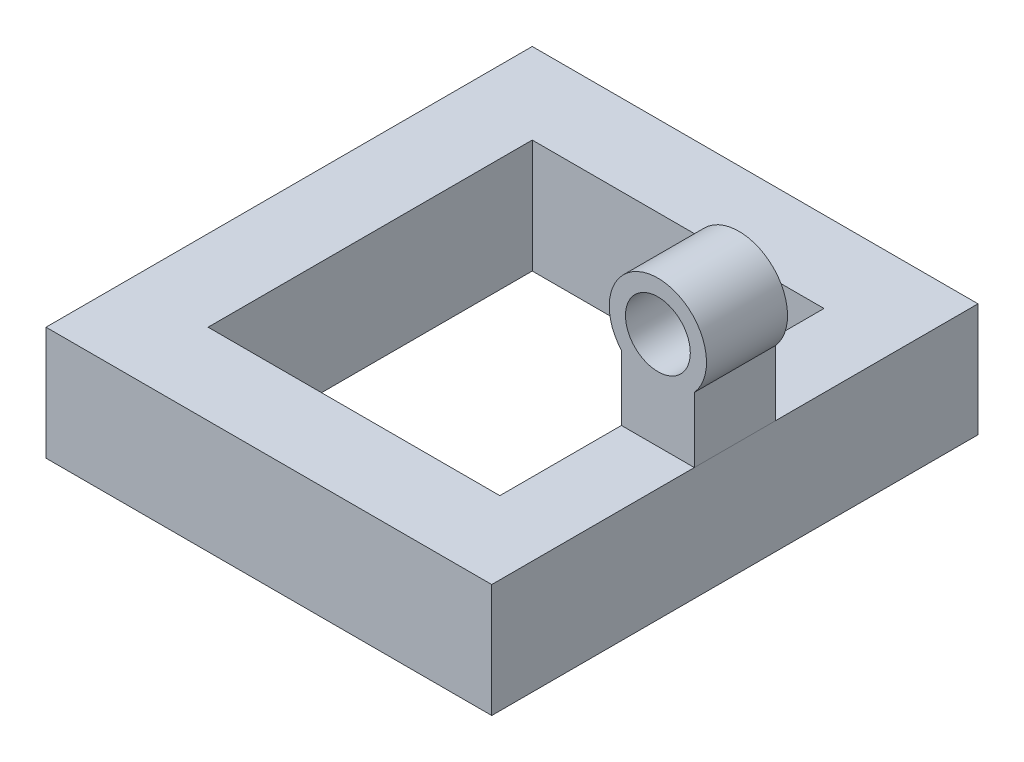
ISO-10303-21;
HEADER;
FILE_DESCRIPTION(('STEP AP214'),'2;1');
FILE_NAME('part.step','',(''),(''),'','','');
FILE_SCHEMA(('AUTOMOTIVE_DESIGN { 1 0 10303 214 1 1 1 1 }'));
ENDSEC;
DATA;
#1=APPLICATION_CONTEXT('core data for automotive mechanical design processes');
#2=APPLICATION_PROTOCOL_DEFINITION('international standard','automotive_design',2000,#1);
#3=PRODUCT_CONTEXT('',#1,'mechanical');
#4=PRODUCT('Part','Part','',(#3));
#5=PRODUCT_RELATED_PRODUCT_CATEGORY('part','',(#4));
#6=PRODUCT_DEFINITION_FORMATION('','',#4);
#7=PRODUCT_DEFINITION_CONTEXT('part definition',#1,'design');
#8=PRODUCT_DEFINITION('design','',#6,#7);
#9=PRODUCT_DEFINITION_SHAPE('','',#8);
#10=(LENGTH_UNIT() NAMED_UNIT(*) SI_UNIT(.MILLI.,.METRE.));
#11=(NAMED_UNIT(*) PLANE_ANGLE_UNIT() SI_UNIT($,.RADIAN.));
#12=(NAMED_UNIT(*) SI_UNIT($,.STERADIAN.) SOLID_ANGLE_UNIT());
#13=UNCERTAINTY_MEASURE_WITH_UNIT(LENGTH_MEASURE(1.E-05),#10,'distance_accuracy_value','');
#14=(GEOMETRIC_REPRESENTATION_CONTEXT(3) GLOBAL_UNCERTAINTY_ASSIGNED_CONTEXT((#13)) GLOBAL_UNIT_ASSIGNED_CONTEXT((#10,
#11,#12)) REPRESENTATION_CONTEXT('',''));
#15=CARTESIAN_POINT('',(0.,0.,0.));
#16=DIRECTION('',(0.,0.,1.));
#17=DIRECTION('',(1.,0.,0.));
#18=AXIS2_PLACEMENT_3D('',#15,#16,#17);
#19=CARTESIAN_POINT('',(50.5,26.,-25.));
#20=DIRECTION('',(0.,0.,1.));
#21=DIRECTION('',(1.,0.,0.));
#22=AXIS2_PLACEMENT_3D('',#19,#20,#21);
#23=PLANE('',#22);
#24=DIRECTION('',(0.,1.,0.));
#25=VECTOR('',#24,1.);
#26=CARTESIAN_POINT('',(55.,14.,-25.));
#27=LINE('',#26,#25);
#28=CARTESIAN_POINT('',(55.,14.,-25.));
#29=VERTEX_POINT('',#28);
#30=CARTESIAN_POINT('',(55.,22.0313730334031,-25.));
#31=VERTEX_POINT('',#30);
#32=EDGE_CURVE('E106',#29,#31,#27,.T.);
#33=ORIENTED_EDGE('',*,*,#32,.T.);
#34=CARTESIAN_POINT('',(50.5,26.,-25.));
#35=DIRECTION('',(0.,0.,1.));
#36=DIRECTION('',(1.,0.,0.));
#37=AXIS2_PLACEMENT_3D('',#34,#35,#36);
#38=CIRCLE('',#37,5.99999999999999);
#39=CARTESIAN_POINT('',(46.,22.0313730334031,-25.));
#40=VERTEX_POINT('',#39);
#41=EDGE_CURVE('E100',#31,#40,#38,.T.);
#42=ORIENTED_EDGE('',*,*,#41,.T.);
#43=DIRECTION('',(0.,-1.,0.));
#44=VECTOR('',#43,1.);
#45=CARTESIAN_POINT('',(46.,14.,-25.));
#46=LINE('',#45,#44);
#47=CARTESIAN_POINT('',(46.,14.,-25.));
#48=VERTEX_POINT('',#47);
#49=EDGE_CURVE('E103',#40,#48,#46,.T.);
#50=ORIENTED_EDGE('',*,*,#49,.T.);
#51=DIRECTION('',(1.,0.,0.));
#52=VECTOR('',#51,1.);
#53=CARTESIAN_POINT('',(50.5,14.,-25.));
#54=LINE('',#53,#52);
#55=EDGE_CURVE('E72',#48,#29,#54,.T.);
#56=ORIENTED_EDGE('',*,*,#55,.T.);
#57=EDGE_LOOP('',(#33,#42,#50,#56));
#58=FACE_BOUND('',#57,.T.);
#59=CARTESIAN_POINT('',(50.5,26.,-25.));
#60=DIRECTION('',(0.,0.,1.));
#61=DIRECTION('',(1.,0.,0.));
#62=AXIS2_PLACEMENT_3D('',#59,#60,#61);
#63=CIRCLE('',#62,4.);
#64=CARTESIAN_POINT('',(54.5,26.,-25.));
#65=VERTEX_POINT('',#64);
#66=EDGE_CURVE('E123',#65,#65,#63,.T.);
#67=ORIENTED_EDGE('',*,*,#66,.F.);
#68=EDGE_LOOP('',(#67));
#69=FACE_BOUND('',#68,.T.);
#70=ADVANCED_FACE('F55',(#58,#69),#23,.T.);
#71=CARTESIAN_POINT('',(50.5,26.,-35.));
#72=DIRECTION('',(0.,0.,1.));
#73=DIRECTION('',(1.,0.,0.));
#74=AXIS2_PLACEMENT_3D('',#71,#72,#73);
#75=PLANE('',#74);
#76=DIRECTION('',(0.,1.,0.));
#77=VECTOR('',#76,1.);
#78=CARTESIAN_POINT('',(55.,14.,-35.));
#79=LINE('',#78,#77);
#80=CARTESIAN_POINT('',(55.,14.,-35.));
#81=VERTEX_POINT('',#80);
#82=CARTESIAN_POINT('',(55.,22.0313730334031,-35.));
#83=VERTEX_POINT('',#82);
#84=EDGE_CURVE('E120',#81,#83,#79,.T.);
#85=ORIENTED_EDGE('',*,*,#84,.F.);
#86=DIRECTION('',(1.,0.,0.));
#87=VECTOR('',#86,1.);
#88=CARTESIAN_POINT('',(55.,14.,-35.));
#89=LINE('',#88,#87);
#90=CARTESIAN_POINT('',(46.,14.,-35.));
#91=VERTEX_POINT('',#90);
#92=EDGE_CURVE('E89',#91,#81,#89,.T.);
#93=ORIENTED_EDGE('',*,*,#92,.F.);
#94=DIRECTION('',(0.,-1.,0.));
#95=VECTOR('',#94,1.);
#96=CARTESIAN_POINT('',(46.,14.,-35.));
#97=LINE('',#96,#95);
#98=CARTESIAN_POINT('',(46.,22.0313730334031,-35.));
#99=VERTEX_POINT('',#98);
#100=EDGE_CURVE('E125',#99,#91,#97,.T.);
#101=ORIENTED_EDGE('',*,*,#100,.F.);
#102=CARTESIAN_POINT('',(50.5,26.,-35.));
#103=DIRECTION('',(0.,0.,1.));
#104=DIRECTION('',(1.,0.,0.));
#105=AXIS2_PLACEMENT_3D('',#102,#103,#104);
#106=CIRCLE('',#105,5.99999999999999);
#107=EDGE_CURVE('E111',#83,#99,#106,.T.);
#108=ORIENTED_EDGE('',*,*,#107,.F.);
#109=EDGE_LOOP('',(#85,#93,#101,#108));
#110=FACE_BOUND('',#109,.T.);
#111=CARTESIAN_POINT('',(50.5,26.,-35.));
#112=DIRECTION('',(0.,0.,1.));
#113=DIRECTION('',(1.,0.,0.));
#114=AXIS2_PLACEMENT_3D('',#111,#112,#113);
#115=CIRCLE('',#114,4.);
#116=CARTESIAN_POINT('',(54.5,26.,-35.));
#117=VERTEX_POINT('',#116);
#118=EDGE_CURVE('E132',#117,#117,#115,.T.);
#119=ORIENTED_EDGE('',*,*,#118,.T.);
#120=EDGE_LOOP('',(#119));
#121=FACE_BOUND('',#120,.T.);
#122=ADVANCED_FACE('F141',(#110,#121),#75,.F.);
#123=CARTESIAN_POINT('',(55.,14.,-25.));
#124=DIRECTION('',(-1.,0.,0.));
#125=DIRECTION('',(0.,0.,1.));
#126=AXIS2_PLACEMENT_3D('',#123,#124,#125);
#127=PLANE('',#126);
#128=ORIENTED_EDGE('',*,*,#84,.T.);
#129=DIRECTION('',(0.,0.,-1.));
#130=VECTOR('',#129,1.);
#131=CARTESIAN_POINT('',(55.,22.0313730334031,-25.));
#132=LINE('',#131,#130);
#133=EDGE_CURVE('E12',#31,#83,#132,.T.);
#134=ORIENTED_EDGE('',*,*,#133,.F.);
#135=ORIENTED_EDGE('',*,*,#32,.F.);
#136=DIRECTION('',(0.,0.,-1.));
#137=VECTOR('',#136,1.);
#138=CARTESIAN_POINT('',(55.,14.,-25.));
#139=LINE('',#138,#137);
#140=EDGE_CURVE('E116',#29,#81,#139,.T.);
#141=ORIENTED_EDGE('',*,*,#140,.T.);
#142=EDGE_LOOP('',(#128,#134,#135,#141));
#143=FACE_BOUND('',#142,.T.);
#144=ADVANCED_FACE('F57',(#143),#127,.F.);
#145=CARTESIAN_POINT('',(50.5,26.,-25.));
#146=DIRECTION('',(0.,0.,-1.));
#147=DIRECTION('',(-1.,0.,0.));
#148=AXIS2_PLACEMENT_3D('',#145,#146,#147);
#149=CYLINDRICAL_SURFACE('',#148,5.99999999999999);
#150=ORIENTED_EDGE('',*,*,#107,.T.);
#151=DIRECTION('',(0.,0.,-1.));
#152=VECTOR('',#151,1.);
#153=CARTESIAN_POINT('',(46.,22.0313730334031,-25.));
#154=LINE('',#153,#152);
#155=EDGE_CURVE('E64',#40,#99,#154,.T.);
#156=ORIENTED_EDGE('',*,*,#155,.F.);
#157=ORIENTED_EDGE('',*,*,#41,.F.);
#158=ORIENTED_EDGE('',*,*,#133,.T.);
#159=EDGE_LOOP('',(#150,#156,#157,#158));
#160=FACE_BOUND('',#159,.T.);
#161=ADVANCED_FACE('F110',(#160),#149,.T.);
#162=CARTESIAN_POINT('',(46.,14.,-25.));
#163=DIRECTION('',(1.,0.,0.));
#164=DIRECTION('',(0.,0.,-1.));
#165=AXIS2_PLACEMENT_3D('',#162,#163,#164);
#166=PLANE('',#165);
#167=ORIENTED_EDGE('',*,*,#100,.T.);
#168=DIRECTION('',(0.,0.,-1.));
#169=VECTOR('',#168,1.);
#170=CARTESIAN_POINT('',(46.,14.,-25.));
#171=LINE('',#170,#169);
#172=EDGE_CURVE('E113',#48,#91,#171,.T.);
#173=ORIENTED_EDGE('',*,*,#172,.F.);
#174=ORIENTED_EDGE('',*,*,#49,.F.);
#175=ORIENTED_EDGE('',*,*,#155,.T.);
#176=EDGE_LOOP('',(#167,#173,#174,#175));
#177=FACE_BOUND('',#176,.T.);
#178=ADVANCED_FACE('F114',(#177),#166,.F.);
#179=CARTESIAN_POINT('',(55.,14.,-25.));
#180=DIRECTION('',(0.,1.,0.));
#181=DIRECTION('',(0.,0.,1.));
#182=AXIS2_PLACEMENT_3D('',#179,#180,#181);
#183=PLANE('',#182);
#184=ORIENTED_EDGE('',*,*,#92,.T.);
#185=ORIENTED_EDGE('',*,*,#140,.F.);
#186=ORIENTED_EDGE('',*,*,#55,.F.);
#187=ORIENTED_EDGE('',*,*,#172,.T.);
#188=EDGE_LOOP('',(#184,#185,#186,#187));
#189=FACE_BOUND('',#188,.T.);
#190=ADVANCED_FACE('F129',(#189),#183,.F.);
#191=CARTESIAN_POINT('',(50.5,26.,-25.));
#192=DIRECTION('',(0.,0.,-1.));
#193=DIRECTION('',(-1.,0.,0.));
#194=AXIS2_PLACEMENT_3D('',#191,#192,#193);
#195=CYLINDRICAL_SURFACE('',#194,4.);
#196=ORIENTED_EDGE('',*,*,#66,.T.);
#197=EDGE_LOOP('',(#196));
#198=FACE_BOUND('',#197,.T.);
#199=ORIENTED_EDGE('',*,*,#118,.F.);
#200=EDGE_LOOP('',(#199));
#201=FACE_BOUND('',#200,.T.);
#202=ADVANCED_FACE('F138',(#198,#201),#195,.F.);
#203=CLOSED_SHELL('',(#70,#122,#144,#161,#178,#190,#202));
#204=MANIFOLD_SOLID_BREP('B2',#203);
#205=CARTESIAN_POINT('',(0.,14.,-60.));
#206=DIRECTION('',(1.,0.,0.));
#207=DIRECTION('',(0.,0.,-1.));
#208=AXIS2_PLACEMENT_3D('',#205,#206,#207);
#209=PLANE('',#208);
#210=DIRECTION('',(0.,0.,1.));
#211=VECTOR('',#210,1.);
#212=CARTESIAN_POINT('',(0.,0.,-60.));
#213=LINE('',#212,#211);
#214=CARTESIAN_POINT('',(0.,0.,-60.));
#215=VERTEX_POINT('',#214);
#216=CARTESIAN_POINT('',(0.,0.,0.));
#217=VERTEX_POINT('',#216);
#218=EDGE_CURVE('E314',#215,#217,#213,.T.);
#219=ORIENTED_EDGE('',*,*,#218,.T.);
#220=DIRECTION('',(0.,-1.,0.));
#221=VECTOR('',#220,1.);
#222=CARTESIAN_POINT('',(0.,14.,0.));
#223=LINE('',#222,#221);
#224=CARTESIAN_POINT('',(0.,14.,0.));
#225=VERTEX_POINT('',#224);
#226=EDGE_CURVE('E53',#225,#217,#223,.T.);
#227=ORIENTED_EDGE('',*,*,#226,.F.);
#228=DIRECTION('',(0.,0.,1.));
#229=VECTOR('',#228,1.);
#230=CARTESIAN_POINT('',(0.,14.,-60.));
#231=LINE('',#230,#229);
#232=CARTESIAN_POINT('',(0.,14.,-60.));
#233=VERTEX_POINT('',#232);
#234=EDGE_CURVE('E315',#233,#225,#231,.T.);
#235=ORIENTED_EDGE('',*,*,#234,.F.);
#236=DIRECTION('',(0.,-1.,0.));
#237=VECTOR('',#236,1.);
#238=CARTESIAN_POINT('',(0.,14.,-60.));
#239=LINE('',#238,#237);
#240=EDGE_CURVE('E329',#233,#215,#239,.T.);
#241=ORIENTED_EDGE('',*,*,#240,.T.);
#242=EDGE_LOOP('',(#219,#227,#235,#241));
#243=FACE_BOUND('',#242,.T.);
#244=ADVANCED_FACE('F203',(#243),#209,.F.);
#245=CARTESIAN_POINT('',(0.,14.,0.));
#246=DIRECTION('',(0.,0.,-1.));
#247=DIRECTION('',(-1.,0.,0.));
#248=AXIS2_PLACEMENT_3D('',#245,#246,#247);
#249=PLANE('',#248);
#250=DIRECTION('',(1.,0.,0.));
#251=VECTOR('',#250,1.);
#252=CARTESIAN_POINT('',(0.,0.,0.));
#253=LINE('',#252,#251);
#254=CARTESIAN_POINT('',(55.,0.,0.));
#255=VERTEX_POINT('',#254);
#256=EDGE_CURVE('E333',#217,#255,#253,.T.);
#257=ORIENTED_EDGE('',*,*,#256,.T.);
#258=DIRECTION('',(0.,-1.,0.));
#259=VECTOR('',#258,1.);
#260=CARTESIAN_POINT('',(55.,14.,0.));
#261=LINE('',#260,#259);
#262=CARTESIAN_POINT('',(55.,14.,0.));
#263=VERTEX_POINT('',#262);
#264=EDGE_CURVE('E211',#263,#255,#261,.T.);
#265=ORIENTED_EDGE('',*,*,#264,.F.);
#266=DIRECTION('',(1.,0.,0.));
#267=VECTOR('',#266,1.);
#268=CARTESIAN_POINT('',(0.,14.,0.));
#269=LINE('',#268,#267);
#270=EDGE_CURVE('E319',#225,#263,#269,.T.);
#271=ORIENTED_EDGE('',*,*,#270,.F.);
#272=ORIENTED_EDGE('',*,*,#226,.T.);
#273=EDGE_LOOP('',(#257,#265,#271,#272));
#274=FACE_BOUND('',#273,.T.);
#275=ADVANCED_FACE('F367',(#274),#249,.F.);
#276=CARTESIAN_POINT('',(55.,14.,0.));
#277=DIRECTION('',(-1.,0.,0.));
#278=DIRECTION('',(0.,0.,1.));
#279=AXIS2_PLACEMENT_3D('',#276,#277,#278);
#280=PLANE('',#279);
#281=DIRECTION('',(0.,0.,-1.));
#282=VECTOR('',#281,1.);
#283=CARTESIAN_POINT('',(55.,0.,0.));
#284=LINE('',#283,#282);
#285=CARTESIAN_POINT('',(55.,0.,-60.));
#286=VERTEX_POINT('',#285);
#287=EDGE_CURVE('E336',#255,#286,#284,.T.);
#288=ORIENTED_EDGE('',*,*,#287,.T.);
#289=DIRECTION('',(0.,-1.,0.));
#290=VECTOR('',#289,1.);
#291=CARTESIAN_POINT('',(55.,14.,-60.));
#292=LINE('',#291,#290);
#293=CARTESIAN_POINT('',(55.,14.,-60.));
#294=VERTEX_POINT('',#293);
#295=EDGE_CURVE('E344',#294,#286,#292,.T.);
#296=ORIENTED_EDGE('',*,*,#295,.F.);
#297=DIRECTION('',(0.,0.,-1.));
#298=VECTOR('',#297,1.);
#299=CARTESIAN_POINT('',(55.,14.,0.));
#300=LINE('',#299,#298);
#301=EDGE_CURVE('E323',#263,#294,#300,.T.);
#302=ORIENTED_EDGE('',*,*,#301,.F.);
#303=ORIENTED_EDGE('',*,*,#264,.T.);
#304=EDGE_LOOP('',(#288,#296,#302,#303));
#305=FACE_BOUND('',#304,.T.);
#306=ADVANCED_FACE('F353',(#305),#280,.F.);
#307=CARTESIAN_POINT('',(55.,14.,-60.));
#308=DIRECTION('',(0.,0.,1.));
#309=DIRECTION('',(1.,0.,0.));
#310=AXIS2_PLACEMENT_3D('',#307,#308,#309);
#311=PLANE('',#310);
#312=DIRECTION('',(-1.,0.,0.));
#313=VECTOR('',#312,1.);
#314=CARTESIAN_POINT('',(55.,0.,-60.));
#315=LINE('',#314,#313);
#316=EDGE_CURVE('E320',#286,#215,#315,.T.);
#317=ORIENTED_EDGE('',*,*,#316,.T.);
#318=ORIENTED_EDGE('',*,*,#240,.F.);
#319=DIRECTION('',(-1.,0.,0.));
#320=VECTOR('',#319,1.);
#321=CARTESIAN_POINT('',(55.,14.,-60.));
#322=LINE('',#321,#320);
#323=EDGE_CURVE('E326',#294,#233,#322,.T.);
#324=ORIENTED_EDGE('',*,*,#323,.F.);
#325=ORIENTED_EDGE('',*,*,#295,.T.);
#326=EDGE_LOOP('',(#317,#318,#324,#325));
#327=FACE_BOUND('',#326,.T.);
#328=ADVANCED_FACE('F360',(#327),#311,.F.);
#329=CARTESIAN_POINT('',(0.,14.,0.));
#330=DIRECTION('',(0.,1.,0.));
#331=DIRECTION('',(0.,0.,1.));
#332=AXIS2_PLACEMENT_3D('',#329,#330,#331);
#333=PLANE('',#332);
#334=DIRECTION('',(1.,0.,0.));
#335=VECTOR('',#334,1.);
#336=CARTESIAN_POINT('',(0.,14.,-10.));
#337=LINE('',#336,#335);
#338=CARTESIAN_POINT('',(10.,14.,-10.));
#339=VERTEX_POINT('',#338);
#340=CARTESIAN_POINT('',(46.,14.,-10.));
#341=VERTEX_POINT('',#340);
#342=EDGE_CURVE('E311',#339,#341,#337,.T.);
#343=ORIENTED_EDGE('',*,*,#342,.F.);
#344=DIRECTION('',(0.,0.,1.));
#345=VECTOR('',#344,1.);
#346=CARTESIAN_POINT('',(10.,14.,0.));
#347=LINE('',#346,#345);
#348=CARTESIAN_POINT('',(10.,14.,-50.));
#349=VERTEX_POINT('',#348);
#350=EDGE_CURVE('E299',#349,#339,#347,.T.);
#351=ORIENTED_EDGE('',*,*,#350,.F.);
#352=DIRECTION('',(-1.,0.,0.));
#353=VECTOR('',#352,1.);
#354=CARTESIAN_POINT('',(0.,14.,-50.));
#355=LINE('',#354,#353);
#356=CARTESIAN_POINT('',(46.,14.,-50.));
#357=VERTEX_POINT('',#356);
#358=EDGE_CURVE('E274',#357,#349,#355,.T.);
#359=ORIENTED_EDGE('',*,*,#358,.F.);
#360=DIRECTION('',(0.,0.,-1.));
#361=VECTOR('',#360,1.);
#362=CARTESIAN_POINT('',(46.,14.,0.));
#363=LINE('',#362,#361);
#364=EDGE_CURVE('E308',#341,#357,#363,.T.);
#365=ORIENTED_EDGE('',*,*,#364,.F.);
#366=EDGE_LOOP('',(#343,#351,#359,#365));
#367=FACE_BOUND('',#366,.T.);
#368=ORIENTED_EDGE('',*,*,#234,.T.);
#369=ORIENTED_EDGE('',*,*,#270,.T.);
#370=ORIENTED_EDGE('',*,*,#301,.T.);
#371=ORIENTED_EDGE('',*,*,#323,.T.);
#372=EDGE_LOOP('',(#368,#369,#370,#371));
#373=FACE_BOUND('',#372,.T.);
#374=ADVANCED_FACE('F366',(#367,#373),#333,.T.);
#375=CARTESIAN_POINT('',(0.,0.,0.));
#376=DIRECTION('',(0.,1.,0.));
#377=DIRECTION('',(0.,0.,1.));
#378=AXIS2_PLACEMENT_3D('',#375,#376,#377);
#379=PLANE('',#378);
#380=DIRECTION('',(0.,0.,-1.));
#381=VECTOR('',#380,1.);
#382=CARTESIAN_POINT('',(10.,0.,-10.));
#383=LINE('',#382,#381);
#384=CARTESIAN_POINT('',(10.,0.,-10.));
#385=VERTEX_POINT('',#384);
#386=CARTESIAN_POINT('',(10.,0.,-50.));
#387=VERTEX_POINT('',#386);
#388=EDGE_CURVE('E281',#385,#387,#383,.T.);
#389=ORIENTED_EDGE('',*,*,#388,.F.);
#390=DIRECTION('',(-1.,0.,0.));
#391=VECTOR('',#390,1.);
#392=CARTESIAN_POINT('',(46.,0.,-10.));
#393=LINE('',#392,#391);
#394=CARTESIAN_POINT('',(46.,0.,-10.));
#395=VERTEX_POINT('',#394);
#396=EDGE_CURVE('E226',#395,#385,#393,.T.);
#397=ORIENTED_EDGE('',*,*,#396,.F.);
#398=DIRECTION('',(0.,0.,1.));
#399=VECTOR('',#398,1.);
#400=CARTESIAN_POINT('',(46.,0.,-50.));
#401=LINE('',#400,#399);
#402=CARTESIAN_POINT('',(46.,0.,-50.));
#403=VERTEX_POINT('',#402);
#404=EDGE_CURVE('E289',#403,#395,#401,.T.);
#405=ORIENTED_EDGE('',*,*,#404,.F.);
#406=DIRECTION('',(1.,0.,0.));
#407=VECTOR('',#406,1.);
#408=CARTESIAN_POINT('',(10.,0.,-50.));
#409=LINE('',#408,#407);
#410=EDGE_CURVE('E271',#387,#403,#409,.T.);
#411=ORIENTED_EDGE('',*,*,#410,.F.);
#412=EDGE_LOOP('',(#389,#397,#405,#411));
#413=FACE_BOUND('',#412,.T.);
#414=ORIENTED_EDGE('',*,*,#218,.F.);
#415=ORIENTED_EDGE('',*,*,#316,.F.);
#416=ORIENTED_EDGE('',*,*,#287,.F.);
#417=ORIENTED_EDGE('',*,*,#256,.F.);
#418=EDGE_LOOP('',(#414,#415,#416,#417));
#419=FACE_BOUND('',#418,.T.);
#420=ADVANCED_FACE('F286',(#413,#419),#379,.F.);
#421=CARTESIAN_POINT('',(46.,15.,-10.));
#422=DIRECTION('',(0.,0.,1.));
#423=DIRECTION('',(1.,0.,0.));
#424=AXIS2_PLACEMENT_3D('',#421,#422,#423);
#425=PLANE('',#424);
#426=ORIENTED_EDGE('',*,*,#342,.T.);
#427=DIRECTION('',(0.,-1.,0.));
#428=VECTOR('',#427,1.);
#429=CARTESIAN_POINT('',(46.,15.,-10.));
#430=LINE('',#429,#428);
#431=EDGE_CURVE('E296',#341,#395,#430,.T.);
#432=ORIENTED_EDGE('',*,*,#431,.T.);
#433=ORIENTED_EDGE('',*,*,#396,.T.);
#434=DIRECTION('',(0.,-1.,0.));
#435=VECTOR('',#434,1.);
#436=CARTESIAN_POINT('',(10.,15.,-10.));
#437=LINE('',#436,#435);
#438=EDGE_CURVE('E278',#339,#385,#437,.T.);
#439=ORIENTED_EDGE('',*,*,#438,.F.);
#440=EDGE_LOOP('',(#426,#432,#433,#439));
#441=FACE_BOUND('',#440,.T.);
#442=ADVANCED_FACE('F379',(#441),#425,.F.);
#443=CARTESIAN_POINT('',(46.,15.,-50.));
#444=DIRECTION('',(1.,0.,0.));
#445=DIRECTION('',(0.,0.,-1.));
#446=AXIS2_PLACEMENT_3D('',#443,#444,#445);
#447=PLANE('',#446);
#448=ORIENTED_EDGE('',*,*,#364,.T.);
#449=DIRECTION('',(0.,-1.,0.));
#450=VECTOR('',#449,1.);
#451=CARTESIAN_POINT('',(46.,15.,-50.));
#452=LINE('',#451,#450);
#453=EDGE_CURVE('E277',#357,#403,#452,.T.);
#454=ORIENTED_EDGE('',*,*,#453,.T.);
#455=ORIENTED_EDGE('',*,*,#404,.T.);
#456=ORIENTED_EDGE('',*,*,#431,.F.);
#457=EDGE_LOOP('',(#448,#454,#455,#456));
#458=FACE_BOUND('',#457,.T.);
#459=ADVANCED_FACE('F385',(#458),#447,.F.);
#460=CARTESIAN_POINT('',(10.,15.,-50.));
#461=DIRECTION('',(0.,0.,-1.));
#462=DIRECTION('',(-1.,0.,0.));
#463=AXIS2_PLACEMENT_3D('',#460,#461,#462);
#464=PLANE('',#463);
#465=ORIENTED_EDGE('',*,*,#358,.T.);
#466=DIRECTION('',(0.,-1.,0.));
#467=VECTOR('',#466,1.);
#468=CARTESIAN_POINT('',(10.,15.,-50.));
#469=LINE('',#468,#467);
#470=EDGE_CURVE('E218',#349,#387,#469,.T.);
#471=ORIENTED_EDGE('',*,*,#470,.T.);
#472=ORIENTED_EDGE('',*,*,#410,.T.);
#473=ORIENTED_EDGE('',*,*,#453,.F.);
#474=EDGE_LOOP('',(#465,#471,#472,#473));
#475=FACE_BOUND('',#474,.T.);
#476=ADVANCED_FACE('F268',(#475),#464,.F.);
#477=CARTESIAN_POINT('',(10.,15.,-10.));
#478=DIRECTION('',(-1.,0.,0.));
#479=DIRECTION('',(0.,0.,1.));
#480=AXIS2_PLACEMENT_3D('',#477,#478,#479);
#481=PLANE('',#480);
#482=ORIENTED_EDGE('',*,*,#350,.T.);
#483=ORIENTED_EDGE('',*,*,#438,.T.);
#484=ORIENTED_EDGE('',*,*,#388,.T.);
#485=ORIENTED_EDGE('',*,*,#470,.F.);
#486=EDGE_LOOP('',(#482,#483,#484,#485));
#487=FACE_BOUND('',#486,.T.);
#488=ADVANCED_FACE('F282',(#487),#481,.F.);
#489=CLOSED_SHELL('',(#244,#275,#306,#328,#374,#420,#442,#459,#476,#488));
#490=MANIFOLD_SOLID_BREP('B6',#489);
#491=ADVANCED_BREP_SHAPE_REPRESENTATION('',(#18,#204,#490),#14);
#492=SHAPE_DEFINITION_REPRESENTATION(#9,#491);
ENDSEC;
END-ISO-10303-21;
